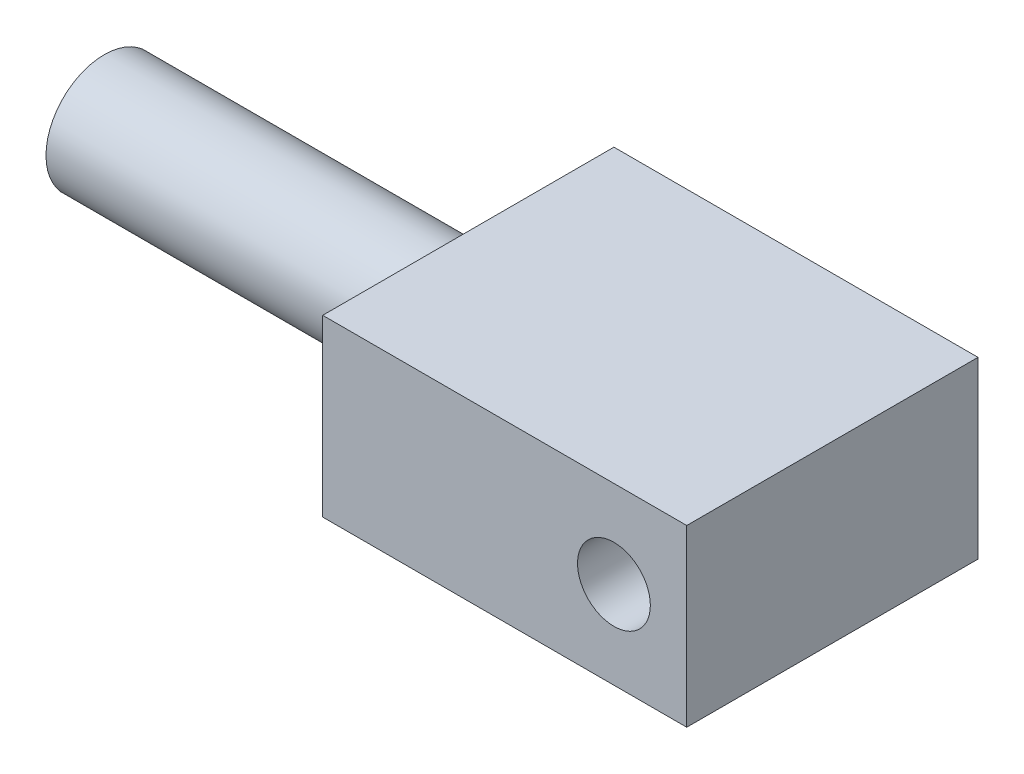
ISO-10303-21;
HEADER;
FILE_DESCRIPTION(('STEP AP214'),'2;1');
FILE_NAME('part.step','',(''),(''),'','','');
FILE_SCHEMA(('AUTOMOTIVE_DESIGN { 1 0 10303 214 1 1 1 1 }'));
ENDSEC;
DATA;
#1=APPLICATION_CONTEXT('core data for automotive mechanical design processes');
#2=APPLICATION_PROTOCOL_DEFINITION('international standard','automotive_design',2000,#1);
#3=PRODUCT_CONTEXT('',#1,'mechanical');
#4=PRODUCT('Part','Part','',(#3));
#5=PRODUCT_RELATED_PRODUCT_CATEGORY('part','',(#4));
#6=PRODUCT_DEFINITION_FORMATION('','',#4);
#7=PRODUCT_DEFINITION_CONTEXT('part definition',#1,'design');
#8=PRODUCT_DEFINITION('design','',#6,#7);
#9=PRODUCT_DEFINITION_SHAPE('','',#8);
#10=(LENGTH_UNIT() NAMED_UNIT(*) SI_UNIT(.MILLI.,.METRE.));
#11=(NAMED_UNIT(*) PLANE_ANGLE_UNIT() SI_UNIT($,.RADIAN.));
#12=(NAMED_UNIT(*) SI_UNIT($,.STERADIAN.) SOLID_ANGLE_UNIT());
#13=UNCERTAINTY_MEASURE_WITH_UNIT(LENGTH_MEASURE(1.E-05),#10,'distance_accuracy_value','');
#14=(GEOMETRIC_REPRESENTATION_CONTEXT(3) GLOBAL_UNCERTAINTY_ASSIGNED_CONTEXT((#13)) GLOBAL_UNIT_ASSIGNED_CONTEXT((#10,
#11,#12)) REPRESENTATION_CONTEXT('',''));
#15=CARTESIAN_POINT('',(0.,0.,0.));
#16=DIRECTION('',(0.,0.,1.));
#17=DIRECTION('',(1.,0.,0.));
#18=AXIS2_PLACEMENT_3D('',#15,#16,#17);
#19=CARTESIAN_POINT('',(0.,-46.6305555757172,0.));
#20=DIRECTION('',(1.,0.,0.));
#21=DIRECTION('',(0.,0.,-1.));
#22=AXIS2_PLACEMENT_3D('',#19,#20,#21);
#23=PLANE('',#22);
#24=DIRECTION('',(0.,1.,0.));
#25=VECTOR('',#24,1.);
#26=CARTESIAN_POINT('',(0.,-34.6305555757172,0.));
#27=LINE('',#26,#25);
#28=CARTESIAN_POINT('',(0.,-46.6305555757172,0.));
#29=VERTEX_POINT('',#28);
#30=CARTESIAN_POINT('',(0.,-34.6305555757172,0.));
#31=VERTEX_POINT('',#30);
#32=EDGE_CURVE('E100',#29,#31,#27,.T.);
#33=ORIENTED_EDGE('',*,*,#32,.F.);
#34=DIRECTION('',(0.,0.,-1.));
#35=VECTOR('',#34,1.);
#36=CARTESIAN_POINT('',(0.,-46.6305555757172,20.));
#37=LINE('',#36,#35);
#38=CARTESIAN_POINT('',(0.,-46.6305555757172,20.));
#39=VERTEX_POINT('',#38);
#40=EDGE_CURVE('E73',#39,#29,#37,.T.);
#41=ORIENTED_EDGE('',*,*,#40,.F.);
#42=DIRECTION('',(0.,-1.,0.));
#43=VECTOR('',#42,1.);
#44=CARTESIAN_POINT('',(0.,-34.6305555757172,20.));
#45=LINE('',#44,#43);
#46=CARTESIAN_POINT('',(0.,-34.6305555757172,20.));
#47=VERTEX_POINT('',#46);
#48=EDGE_CURVE('E67',#47,#39,#45,.T.);
#49=ORIENTED_EDGE('',*,*,#48,.F.);
#50=DIRECTION('',(0.,0.,1.));
#51=VECTOR('',#50,1.);
#52=CARTESIAN_POINT('',(0.,-34.6305555757172,20.));
#53=LINE('',#52,#51);
#54=EDGE_CURVE('E91',#31,#47,#53,.T.);
#55=ORIENTED_EDGE('',*,*,#54,.F.);
#56=EDGE_LOOP('',(#33,#41,#49,#55));
#57=FACE_BOUND('',#56,.T.);
#58=CARTESIAN_POINT('',(0.,-40.6305555757172,10.));
#59=DIRECTION('',(1.,0.,0.));
#60=DIRECTION('',(0.,0.,-1.));
#61=AXIS2_PLACEMENT_3D('',#58,#59,#60);
#62=CIRCLE('',#61,4.);
#63=CARTESIAN_POINT('',(0.,-40.6305555757172,6.00000000000001));
#64=VERTEX_POINT('',#63);
#65=EDGE_CURVE('E11',#64,#64,#62,.F.);
#66=ORIENTED_EDGE('',*,*,#65,.F.);
#67=EDGE_LOOP('',(#66));
#68=FACE_BOUND('',#67,.T.);
#69=ADVANCED_FACE('F33',(#57,#68),#23,.F.);
#70=CARTESIAN_POINT('',(25.,-34.6305555757172,0.));
#71=DIRECTION('',(0.,0.,1.));
#72=DIRECTION('',(0.,-1.,0.));
#73=AXIS2_PLACEMENT_3D('',#70,#71,#72);
#74=PLANE('',#73);
#75=CARTESIAN_POINT('',(20.,-40.6305555757172,0.));
#76=DIRECTION('',(0.,0.,1.));
#77=DIRECTION('',(1.,0.,0.));
#78=AXIS2_PLACEMENT_3D('',#75,#76,#77);
#79=CIRCLE('',#78,2.5);
#80=CARTESIAN_POINT('',(22.5,-40.6305555757172,0.));
#81=VERTEX_POINT('',#80);
#82=EDGE_CURVE('E103',#81,#81,#79,.T.);
#83=ORIENTED_EDGE('',*,*,#82,.T.);
#84=EDGE_LOOP('',(#83));
#85=FACE_BOUND('',#84,.T.);
#86=ORIENTED_EDGE('',*,*,#32,.T.);
#87=DIRECTION('',(-1.,0.,0.));
#88=VECTOR('',#87,1.);
#89=CARTESIAN_POINT('',(25.,-34.6305555757172,0.));
#90=LINE('',#89,#88);
#91=CARTESIAN_POINT('',(25.,-34.6305555757172,0.));
#92=VERTEX_POINT('',#91);
#93=EDGE_CURVE('E42',#92,#31,#90,.T.);
#94=ORIENTED_EDGE('',*,*,#93,.F.);
#95=DIRECTION('',(0.,1.,0.));
#96=VECTOR('',#95,1.);
#97=CARTESIAN_POINT('',(25.,-34.6305555757172,0.));
#98=LINE('',#97,#96);
#99=CARTESIAN_POINT('',(25.,-46.6305555757172,0.));
#100=VERTEX_POINT('',#99);
#101=EDGE_CURVE('E86',#100,#92,#98,.T.);
#102=ORIENTED_EDGE('',*,*,#101,.F.);
#103=DIRECTION('',(-1.,0.,0.));
#104=VECTOR('',#103,1.);
#105=CARTESIAN_POINT('',(25.,-46.6305555757172,0.));
#106=LINE('',#105,#104);
#107=EDGE_CURVE('E96',#100,#29,#106,.T.);
#108=ORIENTED_EDGE('',*,*,#107,.T.);
#109=EDGE_LOOP('',(#86,#94,#102,#108));
#110=FACE_BOUND('',#109,.T.);
#111=ADVANCED_FACE('F35',(#85,#110),#74,.F.);
#112=CARTESIAN_POINT('',(25.,-34.6305555757172,20.));
#113=DIRECTION('',(0.,-1.,0.));
#114=DIRECTION('',(0.,0.,-1.));
#115=AXIS2_PLACEMENT_3D('',#112,#113,#114);
#116=PLANE('',#115);
#117=ORIENTED_EDGE('',*,*,#54,.T.);
#118=DIRECTION('',(-1.,0.,0.));
#119=VECTOR('',#118,1.);
#120=CARTESIAN_POINT('',(25.,-34.6305555757172,20.));
#121=LINE('',#120,#119);
#122=CARTESIAN_POINT('',(25.,-34.6305555757172,20.));
#123=VERTEX_POINT('',#122);
#124=EDGE_CURVE('E89',#123,#47,#121,.T.);
#125=ORIENTED_EDGE('',*,*,#124,.F.);
#126=DIRECTION('',(0.,0.,1.));
#127=VECTOR('',#126,1.);
#128=CARTESIAN_POINT('',(25.,-34.6305555757172,20.));
#129=LINE('',#128,#127);
#130=EDGE_CURVE('E81',#92,#123,#129,.T.);
#131=ORIENTED_EDGE('',*,*,#130,.F.);
#132=ORIENTED_EDGE('',*,*,#93,.T.);
#133=EDGE_LOOP('',(#117,#125,#131,#132));
#134=FACE_BOUND('',#133,.T.);
#135=ADVANCED_FACE('F90',(#134),#116,.F.);
#136=CARTESIAN_POINT('',(25.,-34.6305555757172,20.));
#137=DIRECTION('',(0.,0.,-1.));
#138=DIRECTION('',(0.,1.,0.));
#139=AXIS2_PLACEMENT_3D('',#136,#137,#138);
#140=PLANE('',#139);
#141=CARTESIAN_POINT('',(20.,-40.6305555757172,20.));
#142=DIRECTION('',(0.,0.,1.));
#143=DIRECTION('',(1.,0.,0.));
#144=AXIS2_PLACEMENT_3D('',#141,#142,#143);
#145=CIRCLE('',#144,2.5);
#146=CARTESIAN_POINT('',(22.5,-40.6305555757172,20.));
#147=VERTEX_POINT('',#146);
#148=EDGE_CURVE('E149',#147,#147,#145,.T.);
#149=ORIENTED_EDGE('',*,*,#148,.F.);
#150=EDGE_LOOP('',(#149));
#151=FACE_BOUND('',#150,.T.);
#152=ORIENTED_EDGE('',*,*,#48,.T.);
#153=DIRECTION('',(-1.,0.,0.));
#154=VECTOR('',#153,1.);
#155=CARTESIAN_POINT('',(25.,-46.6305555757172,20.));
#156=LINE('',#155,#154);
#157=CARTESIAN_POINT('',(25.,-46.6305555757172,20.));
#158=VERTEX_POINT('',#157);
#159=EDGE_CURVE('E92',#158,#39,#156,.T.);
#160=ORIENTED_EDGE('',*,*,#159,.F.);
#161=DIRECTION('',(0.,-1.,0.));
#162=VECTOR('',#161,1.);
#163=CARTESIAN_POINT('',(25.,-34.6305555757172,20.));
#164=LINE('',#163,#162);
#165=EDGE_CURVE('E84',#123,#158,#164,.T.);
#166=ORIENTED_EDGE('',*,*,#165,.F.);
#167=ORIENTED_EDGE('',*,*,#124,.T.);
#168=EDGE_LOOP('',(#152,#160,#166,#167));
#169=FACE_BOUND('',#168,.T.);
#170=ADVANCED_FACE('F94',(#151,#169),#140,.F.);
#171=CARTESIAN_POINT('',(25.,-46.6305555757172,20.));
#172=DIRECTION('',(0.,1.,0.));
#173=DIRECTION('',(0.,0.,1.));
#174=AXIS2_PLACEMENT_3D('',#171,#172,#173);
#175=PLANE('',#174);
#176=ORIENTED_EDGE('',*,*,#40,.T.);
#177=ORIENTED_EDGE('',*,*,#107,.F.);
#178=DIRECTION('',(0.,0.,-1.));
#179=VECTOR('',#178,1.);
#180=CARTESIAN_POINT('',(25.,-46.6305555757172,20.));
#181=LINE('',#180,#179);
#182=EDGE_CURVE('E50',#158,#100,#181,.T.);
#183=ORIENTED_EDGE('',*,*,#182,.F.);
#184=ORIENTED_EDGE('',*,*,#159,.T.);
#185=EDGE_LOOP('',(#176,#177,#183,#184));
#186=FACE_BOUND('',#185,.T.);
#187=ADVANCED_FACE('F134',(#186),#175,.F.);
#188=CARTESIAN_POINT('',(25.,-46.6305555757172,0.));
#189=DIRECTION('',(1.,0.,0.));
#190=DIRECTION('',(0.,0.,-1.));
#191=AXIS2_PLACEMENT_3D('',#188,#189,#190);
#192=PLANE('',#191);
#193=ORIENTED_EDGE('',*,*,#101,.T.);
#194=ORIENTED_EDGE('',*,*,#130,.T.);
#195=ORIENTED_EDGE('',*,*,#165,.T.);
#196=ORIENTED_EDGE('',*,*,#182,.T.);
#197=EDGE_LOOP('',(#193,#194,#195,#196));
#198=FACE_BOUND('',#197,.T.);
#199=ADVANCED_FACE('F82',(#198),#192,.T.);
#200=CARTESIAN_POINT('',(20.,-40.6305555757172,0.));
#201=DIRECTION('',(0.,0.,1.));
#202=DIRECTION('',(1.,0.,0.));
#203=AXIS2_PLACEMENT_3D('',#200,#201,#202);
#204=CYLINDRICAL_SURFACE('',#203,2.5);
#205=ORIENTED_EDGE('',*,*,#82,.F.);
#206=EDGE_LOOP('',(#205));
#207=FACE_BOUND('',#206,.T.);
#208=ORIENTED_EDGE('',*,*,#148,.T.);
#209=EDGE_LOOP('',(#208));
#210=FACE_BOUND('',#209,.T.);
#211=ADVANCED_FACE('F119',(#207,#210),#204,.F.);
#212=CARTESIAN_POINT('',(-25.,-40.6305555757172,10.));
#213=DIRECTION('',(1.,0.,0.));
#214=DIRECTION('',(0.,0.,-1.));
#215=AXIS2_PLACEMENT_3D('',#212,#213,#214);
#216=CYLINDRICAL_SURFACE('',#215,4.);
#217=CARTESIAN_POINT('',(-25.,-40.6305555757172,10.));
#218=DIRECTION('',(-1.,0.,0.));
#219=DIRECTION('',(0.,0.,1.));
#220=AXIS2_PLACEMENT_3D('',#217,#218,#219);
#221=CIRCLE('',#220,4.);
#222=CARTESIAN_POINT('',(-25.,-40.6305555757172,14.));
#223=VERTEX_POINT('',#222);
#224=EDGE_CURVE('E152',#223,#223,#221,.T.);
#225=ORIENTED_EDGE('',*,*,#224,.F.);
#226=EDGE_LOOP('',(#225));
#227=FACE_BOUND('',#226,.T.);
#228=ORIENTED_EDGE('',*,*,#65,.T.);
#229=EDGE_LOOP('',(#228));
#230=FACE_BOUND('',#229,.T.);
#231=ADVANCED_FACE('F116',(#227,#230),#216,.T.);
#232=CARTESIAN_POINT('',(-25.,-40.6305555757172,10.));
#233=DIRECTION('',(-1.,0.,0.));
#234=DIRECTION('',(0.,0.,1.));
#235=AXIS2_PLACEMENT_3D('',#232,#233,#234);
#236=PLANE('',#235);
#237=ORIENTED_EDGE('',*,*,#224,.T.);
#238=EDGE_LOOP('',(#237));
#239=FACE_BOUND('',#238,.T.);
#240=ADVANCED_FACE('F118',(#239),#236,.T.);
#241=CLOSED_SHELL('',(#69,#111,#135,#170,#187,#199,#211,#231,#240));
#242=MANIFOLD_SOLID_BREP('B2',#241);
#243=ADVANCED_BREP_SHAPE_REPRESENTATION('',(#18,#242),#14);
#244=SHAPE_DEFINITION_REPRESENTATION(#9,#243);
ENDSEC;
END-ISO-10303-21;
